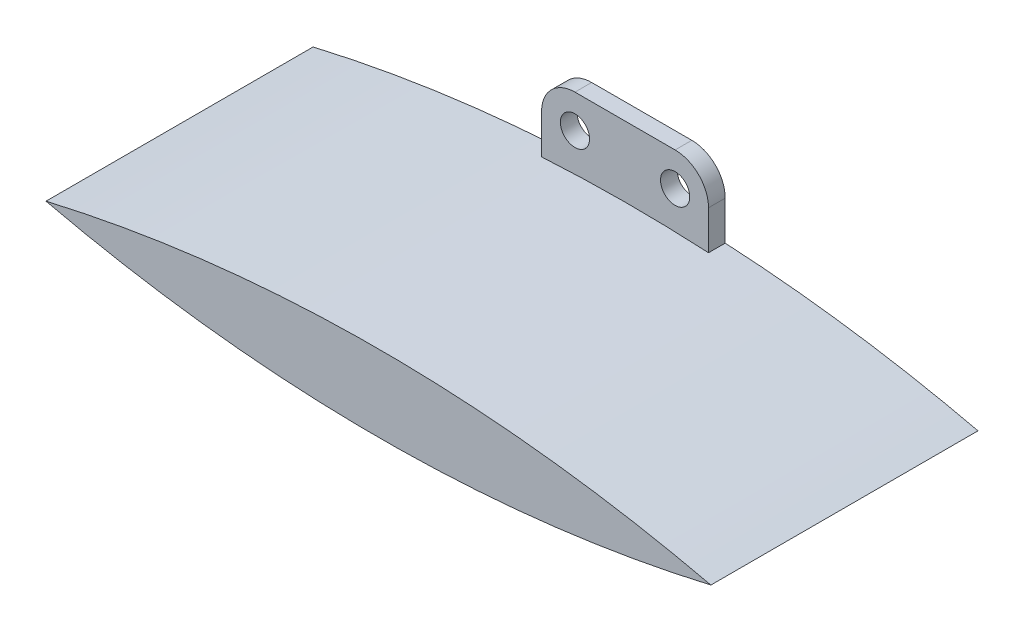
ISO-10303-21;
HEADER;
FILE_DESCRIPTION(('STEP AP214'),'2;1');
FILE_NAME('part.step','',(''),(''),'','','');
FILE_SCHEMA(('AUTOMOTIVE_DESIGN { 1 0 10303 214 1 1 1 1 }'));
ENDSEC;
DATA;
#1=APPLICATION_CONTEXT('core data for automotive mechanical design processes');
#2=APPLICATION_PROTOCOL_DEFINITION('international standard','automotive_design',2000,#1);
#3=PRODUCT_CONTEXT('',#1,'mechanical');
#4=PRODUCT('Part','Part','',(#3));
#5=PRODUCT_RELATED_PRODUCT_CATEGORY('part','',(#4));
#6=PRODUCT_DEFINITION_FORMATION('','',#4);
#7=PRODUCT_DEFINITION_CONTEXT('part definition',#1,'design');
#8=PRODUCT_DEFINITION('design','',#6,#7);
#9=PRODUCT_DEFINITION_SHAPE('','',#8);
#10=(LENGTH_UNIT() NAMED_UNIT(*) SI_UNIT(.MILLI.,.METRE.));
#11=(NAMED_UNIT(*) PLANE_ANGLE_UNIT() SI_UNIT($,.RADIAN.));
#12=(NAMED_UNIT(*) SI_UNIT($,.STERADIAN.) SOLID_ANGLE_UNIT());
#13=UNCERTAINTY_MEASURE_WITH_UNIT(LENGTH_MEASURE(1.E-05),#10,'distance_accuracy_value','');
#14=(GEOMETRIC_REPRESENTATION_CONTEXT(3) GLOBAL_UNCERTAINTY_ASSIGNED_CONTEXT((#13)) GLOBAL_UNIT_ASSIGNED_CONTEXT((#10,
#11,#12)) REPRESENTATION_CONTEXT('',''));
#15=CARTESIAN_POINT('',(0.,0.,0.));
#16=DIRECTION('',(0.,0.,1.));
#17=DIRECTION('',(1.,0.,0.));
#18=AXIS2_PLACEMENT_3D('',#15,#16,#17);
#19=CARTESIAN_POINT('',(-9.2850146485194,-5.0164149337129,2.));
#20=DIRECTION('',(0.,0.,1.));
#21=DIRECTION('',(1.,0.,0.));
#22=AXIS2_PLACEMENT_3D('',#19,#20,#21);
#23=PLANE('',#22);
#24=CARTESIAN_POINT('',(-2.82724176416593,174.391615286075,2.));
#25=DIRECTION('',(0.,0.,1.));
#26=DIRECTION('',(1.,0.,0.));
#27=AXIS2_PLACEMENT_3D('',#24,#25,#26);
#28=CIRCLE('',#27,175.);
#29=CARTESIAN_POINT('',(-13.2850146485194,-0.295633780075577,2.));
#30=VERTEX_POINT('',#29);
#31=CARTESIAN_POINT('',(6.71498535148046,-0.348036486708003,2.));
#32=VERTEX_POINT('',#31);
#33=EDGE_CURVE('E11',#30,#32,#28,.T.);
#34=ORIENTED_EDGE('',*,*,#33,.F.);
#35=DIRECTION('',(0.,-1.,0.));
#36=VECTOR('',#35,1.);
#37=CARTESIAN_POINT('',(-13.2850146485194,-0.295633780075577,2.));
#38=LINE('',#37,#36);
#39=CARTESIAN_POINT('',(-13.2850146485194,-5.0164149337129,2.));
#40=VERTEX_POINT('',#39);
#41=EDGE_CURVE('E54',#30,#40,#38,.T.);
#42=ORIENTED_EDGE('',*,*,#41,.T.);
#43=CARTESIAN_POINT('',(-9.2850146485194,-5.0164149337129,2.));
#44=DIRECTION('',(0.,0.,1.));
#45=DIRECTION('',(1.,0.,0.));
#46=AXIS2_PLACEMENT_3D('',#43,#44,#45);
#47=CIRCLE('',#46,4.);
#48=CARTESIAN_POINT('',(-9.2850146485194,-9.0164149337129,2.));
#49=VERTEX_POINT('',#48);
#50=EDGE_CURVE('E219',#40,#49,#47,.T.);
#51=ORIENTED_EDGE('',*,*,#50,.T.);
#52=DIRECTION('',(1.,0.,0.));
#53=VECTOR('',#52,1.);
#54=CARTESIAN_POINT('',(-9.2850146485194,-9.0164149337129,2.));
#55=LINE('',#54,#53);
#56=CARTESIAN_POINT('',(2.7149853514806,-9.0164149337129,2.));
#57=VERTEX_POINT('',#56);
#58=EDGE_CURVE('E117',#49,#57,#55,.T.);
#59=ORIENTED_EDGE('',*,*,#58,.T.);
#60=CARTESIAN_POINT('',(2.7149853514806,-5.0164149337129,2.));
#61=DIRECTION('',(0.,0.,1.));
#62=DIRECTION('',(1.,0.,0.));
#63=AXIS2_PLACEMENT_3D('',#60,#61,#62);
#64=CIRCLE('',#63,4.);
#65=CARTESIAN_POINT('',(6.7149853514806,-5.0164149337129,2.));
#66=VERTEX_POINT('',#65);
#67=EDGE_CURVE('E250',#57,#66,#64,.T.);
#68=ORIENTED_EDGE('',*,*,#67,.T.);
#69=DIRECTION('',(0.,1.,0.));
#70=VECTOR('',#69,1.);
#71=CARTESIAN_POINT('',(6.7149853514806,-0.348036486708003,2.));
#72=LINE('',#71,#70);
#73=EDGE_CURVE('E191',#66,#32,#72,.T.);
#74=ORIENTED_EDGE('',*,*,#73,.T.);
#75=EDGE_LOOP('',(#34,#42,#51,#59,#68,#74));
#76=FACE_BOUND('',#75,.T.);
#77=CARTESIAN_POINT('',(-9.2850146485194,-5.0164149337129,2.));
#78=DIRECTION('',(0.,0.,1.));
#79=DIRECTION('',(1.,0.,0.));
#80=AXIS2_PLACEMENT_3D('',#77,#78,#79);
#81=CIRCLE('',#80,1.75);
#82=CARTESIAN_POINT('',(-7.5350146485194,-5.0164149337129,2.));
#83=VERTEX_POINT('',#82);
#84=EDGE_CURVE('E257',#83,#83,#81,.T.);
#85=ORIENTED_EDGE('',*,*,#84,.F.);
#86=EDGE_LOOP('',(#85));
#87=FACE_BOUND('',#86,.T.);
#88=CARTESIAN_POINT('',(2.7149853514806,-5.0164149337129,2.));
#89=DIRECTION('',(0.,0.,1.));
#90=DIRECTION('',(1.,0.,0.));
#91=AXIS2_PLACEMENT_3D('',#88,#89,#90);
#92=CIRCLE('',#91,1.75);
#93=CARTESIAN_POINT('',(4.4649853514806,-5.0164149337129,2.));
#94=VERTEX_POINT('',#93);
#95=EDGE_CURVE('E263',#94,#94,#92,.T.);
#96=ORIENTED_EDGE('',*,*,#95,.F.);
#97=EDGE_LOOP('',(#96));
#98=FACE_BOUND('',#97,.T.);
#99=ADVANCED_FACE('F35',(#76,#87,#98),#23,.T.);
#100=CARTESIAN_POINT('',(-2.82724176416593,-166.424445153501,2.));
#101=DIRECTION('',(0.,0.,1.));
#102=DIRECTION('',(1.,0.,0.));
#103=AXIS2_PLACEMENT_3D('',#100,#101,#102);
#104=CIRCLE('',#103,175.);
#105=CARTESIAN_POINT('',(6.7149853514806,8.3152066192822,2.));
#106=VERTEX_POINT('',#105);
#107=CARTESIAN_POINT('',(-13.2850146485194,8.26280391264977,2.));
#108=VERTEX_POINT('',#107);
#109=EDGE_CURVE('E45',#106,#108,#104,.T.);
#110=ORIENTED_EDGE('',*,*,#109,.F.);
#111=DIRECTION('',(0.,1.,0.));
#112=VECTOR('',#111,1.);
#113=CARTESIAN_POINT('',(6.7149853514806,12.9835850662871,2.));
#114=LINE('',#113,#112);
#115=CARTESIAN_POINT('',(6.7149853514806,12.9835850662871,2.));
#116=VERTEX_POINT('',#115);
#117=EDGE_CURVE('E188',#106,#116,#114,.T.);
#118=ORIENTED_EDGE('',*,*,#117,.T.);
#119=CARTESIAN_POINT('',(2.7149853514806,12.9835850662871,2.));
#120=DIRECTION('',(0.,0.,1.));
#121=DIRECTION('',(1.,0.,0.));
#122=AXIS2_PLACEMENT_3D('',#119,#120,#121);
#123=CIRCLE('',#122,4.);
#124=CARTESIAN_POINT('',(2.7149853514806,16.9835850662871,2.));
#125=VERTEX_POINT('',#124);
#126=EDGE_CURVE('E190',#116,#125,#123,.T.);
#127=ORIENTED_EDGE('',*,*,#126,.T.);
#128=DIRECTION('',(-1.,0.,0.));
#129=VECTOR('',#128,1.);
#130=CARTESIAN_POINT('',(-9.2850146485194,16.9835850662871,2.));
#131=LINE('',#130,#129);
#132=CARTESIAN_POINT('',(-9.2850146485194,16.9835850662871,2.));
#133=VERTEX_POINT('',#132);
#134=EDGE_CURVE('E247',#125,#133,#131,.T.);
#135=ORIENTED_EDGE('',*,*,#134,.T.);
#136=CARTESIAN_POINT('',(-9.2850146485194,12.9835850662871,2.));
#137=DIRECTION('',(0.,0.,1.));
#138=DIRECTION('',(1.,0.,0.));
#139=AXIS2_PLACEMENT_3D('',#136,#137,#138);
#140=CIRCLE('',#139,4.);
#141=CARTESIAN_POINT('',(-13.2850146485194,12.9835850662871,2.));
#142=VERTEX_POINT('',#141);
#143=EDGE_CURVE('E152',#133,#142,#140,.T.);
#144=ORIENTED_EDGE('',*,*,#143,.T.);
#145=DIRECTION('',(0.,-1.,0.));
#146=VECTOR('',#145,1.);
#147=CARTESIAN_POINT('',(-13.2850146485194,12.9835850662871,2.));
#148=LINE('',#147,#146);
#149=EDGE_CURVE('E145',#142,#108,#148,.T.);
#150=ORIENTED_EDGE('',*,*,#149,.T.);
#151=EDGE_LOOP('',(#110,#118,#127,#135,#144,#150));
#152=FACE_BOUND('',#151,.T.);
#153=CARTESIAN_POINT('',(-9.2850146485194,12.9835850662871,2.));
#154=DIRECTION('',(0.,0.,1.));
#155=DIRECTION('',(1.,0.,0.));
#156=AXIS2_PLACEMENT_3D('',#153,#154,#155);
#157=CIRCLE('',#156,1.75);
#158=CARTESIAN_POINT('',(-7.5350146485194,12.9835850662871,2.));
#159=VERTEX_POINT('',#158);
#160=EDGE_CURVE('E245',#159,#159,#157,.T.);
#161=ORIENTED_EDGE('',*,*,#160,.F.);
#162=EDGE_LOOP('',(#161));
#163=FACE_BOUND('',#162,.T.);
#164=CARTESIAN_POINT('',(2.7149853514806,12.9835850662871,2.));
#165=DIRECTION('',(0.,0.,1.));
#166=DIRECTION('',(1.,0.,0.));
#167=AXIS2_PLACEMENT_3D('',#164,#165,#166);
#168=CIRCLE('',#167,1.75);
#169=CARTESIAN_POINT('',(4.4649853514806,12.9835850662871,2.));
#170=VERTEX_POINT('',#169);
#171=EDGE_CURVE('E269',#170,#170,#168,.T.);
#172=ORIENTED_EDGE('',*,*,#171,.F.);
#173=EDGE_LOOP('',(#172));
#174=FACE_BOUND('',#173,.T.);
#175=ADVANCED_FACE('F147',(#152,#163,#174),#23,.T.);
#176=CARTESIAN_POINT('',(-9.2850146485194,-5.0164149337129,0.));
#177=DIRECTION('',(0.,0.,1.));
#178=DIRECTION('',(1.,0.,0.));
#179=AXIS2_PLACEMENT_3D('',#176,#177,#178);
#180=PLANE('',#179);
#181=CARTESIAN_POINT('',(2.7149853514806,-5.0164149337129,0.));
#182=DIRECTION('',(0.,0.,1.));
#183=DIRECTION('',(1.,0.,0.));
#184=AXIS2_PLACEMENT_3D('',#181,#182,#183);
#185=CIRCLE('',#184,1.75);
#186=CARTESIAN_POINT('',(4.4649853514806,-5.0164149337129,0.));
#187=VERTEX_POINT('',#186);
#188=EDGE_CURVE('E266',#187,#187,#185,.T.);
#189=ORIENTED_EDGE('',*,*,#188,.T.);
#190=EDGE_LOOP('',(#189));
#191=FACE_BOUND('',#190,.T.);
#192=CARTESIAN_POINT('',(-9.2850146485194,12.9835850662871,0.));
#193=DIRECTION('',(0.,0.,1.));
#194=DIRECTION('',(1.,0.,0.));
#195=AXIS2_PLACEMENT_3D('',#192,#193,#194);
#196=CIRCLE('',#195,1.75);
#197=CARTESIAN_POINT('',(-7.5350146485194,12.9835850662871,0.));
#198=VERTEX_POINT('',#197);
#199=EDGE_CURVE('E254',#198,#198,#196,.T.);
#200=ORIENTED_EDGE('',*,*,#199,.T.);
#201=EDGE_LOOP('',(#200));
#202=FACE_BOUND('',#201,.T.);
#203=CARTESIAN_POINT('',(-9.2850146485194,-5.0164149337129,0.));
#204=DIRECTION('',(0.,0.,1.));
#205=DIRECTION('',(1.,0.,0.));
#206=AXIS2_PLACEMENT_3D('',#203,#204,#205);
#207=CIRCLE('',#206,4.);
#208=CARTESIAN_POINT('',(-13.2850146485194,-5.0164149337129,0.));
#209=VERTEX_POINT('',#208);
#210=CARTESIAN_POINT('',(-9.2850146485194,-9.0164149337129,0.));
#211=VERTEX_POINT('',#210);
#212=EDGE_CURVE('E242',#209,#211,#207,.T.);
#213=ORIENTED_EDGE('',*,*,#212,.F.);
#214=DIRECTION('',(0.,-1.,0.));
#215=VECTOR('',#214,1.);
#216=CARTESIAN_POINT('',(-13.2850146485194,-0.295633780075577,0.));
#217=LINE('',#216,#215);
#218=CARTESIAN_POINT('',(-13.2850146485194,-0.295633780075577,0.));
#219=VERTEX_POINT('',#218);
#220=EDGE_CURVE('E108',#219,#209,#217,.T.);
#221=ORIENTED_EDGE('',*,*,#220,.F.);
#222=CARTESIAN_POINT('',(-2.82724176416593,174.391615286075,0.));
#223=DIRECTION('',(0.,0.,1.));
#224=DIRECTION('',(1.,0.,0.));
#225=AXIS2_PLACEMENT_3D('',#222,#223,#224);
#226=CIRCLE('',#225,175.);
#227=CARTESIAN_POINT('',(-42.6531533872776,3.98358506628713,0.));
#228=VERTEX_POINT('',#227);
#229=EDGE_CURVE('E102',#228,#219,#226,.T.);
#230=ORIENTED_EDGE('',*,*,#229,.F.);
#231=CARTESIAN_POINT('',(-2.82724176416593,-166.424445153501,0.));
#232=DIRECTION('',(0.,0.,1.));
#233=DIRECTION('',(1.,0.,0.));
#234=AXIS2_PLACEMENT_3D('',#231,#232,#233);
#235=CIRCLE('',#234,175.);
#236=CARTESIAN_POINT('',(-13.2850146485194,8.26280391264977,0.));
#237=VERTEX_POINT('',#236);
#238=EDGE_CURVE('E221',#237,#228,#235,.T.);
#239=ORIENTED_EDGE('',*,*,#238,.F.);
#240=DIRECTION('',(0.,-1.,0.));
#241=VECTOR('',#240,1.);
#242=CARTESIAN_POINT('',(-13.2850146485194,12.9835850662871,0.));
#243=LINE('',#242,#241);
#244=CARTESIAN_POINT('',(-13.2850146485194,12.9835850662871,0.));
#245=VERTEX_POINT('',#244);
#246=EDGE_CURVE('E161',#245,#237,#243,.T.);
#247=ORIENTED_EDGE('',*,*,#246,.F.);
#248=CARTESIAN_POINT('',(-9.2850146485194,12.9835850662871,0.));
#249=DIRECTION('',(0.,0.,1.));
#250=DIRECTION('',(1.,0.,0.));
#251=AXIS2_PLACEMENT_3D('',#248,#249,#250);
#252=CIRCLE('',#251,4.);
#253=CARTESIAN_POINT('',(-9.2850146485194,16.9835850662871,0.));
#254=VERTEX_POINT('',#253);
#255=EDGE_CURVE('E224',#254,#245,#252,.T.);
#256=ORIENTED_EDGE('',*,*,#255,.F.);
#257=DIRECTION('',(-1.,0.,0.));
#258=VECTOR('',#257,1.);
#259=CARTESIAN_POINT('',(-9.2850146485194,16.9835850662871,0.));
#260=LINE('',#259,#258);
#261=CARTESIAN_POINT('',(2.7149853514806,16.9835850662871,0.));
#262=VERTEX_POINT('',#261);
#263=EDGE_CURVE('E226',#262,#254,#260,.T.);
#264=ORIENTED_EDGE('',*,*,#263,.F.);
#265=CARTESIAN_POINT('',(2.7149853514806,12.9835850662871,0.));
#266=DIRECTION('',(0.,0.,1.));
#267=DIRECTION('',(1.,0.,0.));
#268=AXIS2_PLACEMENT_3D('',#265,#266,#267);
#269=CIRCLE('',#268,4.);
#270=CARTESIAN_POINT('',(6.7149853514806,12.9835850662871,0.));
#271=VERTEX_POINT('',#270);
#272=EDGE_CURVE('E228',#271,#262,#269,.T.);
#273=ORIENTED_EDGE('',*,*,#272,.F.);
#274=DIRECTION('',(0.,1.,0.));
#275=VECTOR('',#274,1.);
#276=CARTESIAN_POINT('',(6.7149853514806,12.9835850662871,0.));
#277=LINE('',#276,#275);
#278=CARTESIAN_POINT('',(6.7149853514806,8.3152066192822,0.));
#279=VERTEX_POINT('',#278);
#280=EDGE_CURVE('E230',#279,#271,#277,.T.);
#281=ORIENTED_EDGE('',*,*,#280,.F.);
#282=CARTESIAN_POINT('',(-2.82724176416593,-166.424445153501,0.));
#283=DIRECTION('',(0.,0.,1.));
#284=DIRECTION('',(1.,0.,0.));
#285=AXIS2_PLACEMENT_3D('',#282,#283,#284);
#286=CIRCLE('',#285,175.);
#287=CARTESIAN_POINT('',(36.9986698589457,3.98358506628707,0.));
#288=VERTEX_POINT('',#287);
#289=EDGE_CURVE('E232',#288,#279,#286,.T.);
#290=ORIENTED_EDGE('',*,*,#289,.F.);
#291=CARTESIAN_POINT('',(-2.82724176416593,174.391615286075,0.));
#292=DIRECTION('',(0.,0.,1.));
#293=DIRECTION('',(1.,0.,0.));
#294=AXIS2_PLACEMENT_3D('',#291,#292,#293);
#295=CIRCLE('',#294,175.);
#296=CARTESIAN_POINT('',(6.71498535148046,-0.348036486708003,0.));
#297=VERTEX_POINT('',#296);
#298=EDGE_CURVE('E234',#297,#288,#295,.T.);
#299=ORIENTED_EDGE('',*,*,#298,.F.);
#300=DIRECTION('',(0.,1.,0.));
#301=VECTOR('',#300,1.);
#302=CARTESIAN_POINT('',(6.7149853514806,-0.348036486708003,0.));
#303=LINE('',#302,#301);
#304=CARTESIAN_POINT('',(6.7149853514806,-5.0164149337129,0.));
#305=VERTEX_POINT('',#304);
#306=EDGE_CURVE('E236',#305,#297,#303,.T.);
#307=ORIENTED_EDGE('',*,*,#306,.F.);
#308=CARTESIAN_POINT('',(2.7149853514806,-5.0164149337129,0.));
#309=DIRECTION('',(0.,0.,1.));
#310=DIRECTION('',(1.,0.,0.));
#311=AXIS2_PLACEMENT_3D('',#308,#309,#310);
#312=CIRCLE('',#311,4.);
#313=CARTESIAN_POINT('',(2.7149853514806,-9.0164149337129,0.));
#314=VERTEX_POINT('',#313);
#315=EDGE_CURVE('E238',#314,#305,#312,.T.);
#316=ORIENTED_EDGE('',*,*,#315,.F.);
#317=DIRECTION('',(1.,0.,0.));
#318=VECTOR('',#317,1.);
#319=CARTESIAN_POINT('',(-9.2850146485194,-9.0164149337129,0.));
#320=LINE('',#319,#318);
#321=EDGE_CURVE('E240',#211,#314,#320,.T.);
#322=ORIENTED_EDGE('',*,*,#321,.F.);
#323=EDGE_LOOP('',(#213,#221,#230,#239,#247,#256,#264,#273,#281,#290,#299,#307,#316,#322));
#324=FACE_BOUND('',#323,.T.);
#325=CARTESIAN_POINT('',(-9.2850146485194,-5.0164149337129,0.));
#326=DIRECTION('',(0.,0.,1.));
#327=DIRECTION('',(1.,0.,0.));
#328=AXIS2_PLACEMENT_3D('',#325,#326,#327);
#329=CIRCLE('',#328,1.75);
#330=CARTESIAN_POINT('',(-7.5350146485194,-5.0164149337129,0.));
#331=VERTEX_POINT('',#330);
#332=EDGE_CURVE('E260',#331,#331,#329,.T.);
#333=ORIENTED_EDGE('',*,*,#332,.T.);
#334=EDGE_LOOP('',(#333));
#335=FACE_BOUND('',#334,.T.);
#336=CARTESIAN_POINT('',(2.7149853514806,12.9835850662871,0.));
#337=DIRECTION('',(0.,0.,1.));
#338=DIRECTION('',(1.,0.,0.));
#339=AXIS2_PLACEMENT_3D('',#336,#337,#338);
#340=CIRCLE('',#339,1.75);
#341=CARTESIAN_POINT('',(4.4649853514806,12.9835850662871,0.));
#342=VERTEX_POINT('',#341);
#343=EDGE_CURVE('E272',#342,#342,#340,.T.);
#344=ORIENTED_EDGE('',*,*,#343,.T.);
#345=EDGE_LOOP('',(#344));
#346=FACE_BOUND('',#345,.T.);
#347=ADVANCED_FACE('F294',(#191,#202,#324,#335,#346),#180,.F.);
#348=CARTESIAN_POINT('',(-9.2850146485194,-5.0164149337129,2.));
#349=DIRECTION('',(0.,0.,-1.));
#350=DIRECTION('',(-1.,0.,0.));
#351=AXIS2_PLACEMENT_3D('',#348,#349,#350);
#352=CYLINDRICAL_SURFACE('',#351,4.);
#353=ORIENTED_EDGE('',*,*,#212,.T.);
#354=DIRECTION('',(0.,0.,-1.));
#355=VECTOR('',#354,1.);
#356=CARTESIAN_POINT('',(-9.2850146485194,-9.0164149337129,2.));
#357=LINE('',#356,#355);
#358=EDGE_CURVE('E171',#49,#211,#357,.T.);
#359=ORIENTED_EDGE('',*,*,#358,.F.);
#360=ORIENTED_EDGE('',*,*,#50,.F.);
#361=DIRECTION('',(0.,0.,-1.));
#362=VECTOR('',#361,1.);
#363=CARTESIAN_POINT('',(-13.2850146485194,-5.0164149337129,2.));
#364=LINE('',#363,#362);
#365=EDGE_CURVE('E216',#40,#209,#364,.T.);
#366=ORIENTED_EDGE('',*,*,#365,.T.);
#367=EDGE_LOOP('',(#353,#359,#360,#366));
#368=FACE_BOUND('',#367,.T.);
#369=ADVANCED_FACE('F37',(#368),#352,.T.);
#370=CARTESIAN_POINT('',(-9.2850146485194,-9.0164149337129,2.));
#371=DIRECTION('',(0.,1.,0.));
#372=DIRECTION('',(0.,0.,1.));
#373=AXIS2_PLACEMENT_3D('',#370,#371,#372);
#374=PLANE('',#373);
#375=ORIENTED_EDGE('',*,*,#321,.T.);
#376=DIRECTION('',(0.,0.,-1.));
#377=VECTOR('',#376,1.);
#378=CARTESIAN_POINT('',(2.7149853514806,-9.0164149337129,2.));
#379=LINE('',#378,#377);
#380=EDGE_CURVE('E173',#57,#314,#379,.T.);
#381=ORIENTED_EDGE('',*,*,#380,.F.);
#382=ORIENTED_EDGE('',*,*,#58,.F.);
#383=ORIENTED_EDGE('',*,*,#358,.T.);
#384=EDGE_LOOP('',(#375,#381,#382,#383));
#385=FACE_BOUND('',#384,.T.);
#386=ADVANCED_FACE('F490',(#385),#374,.F.);
#387=CARTESIAN_POINT('',(2.7149853514806,-5.0164149337129,2.));
#388=DIRECTION('',(0.,0.,-1.));
#389=DIRECTION('',(-1.,0.,0.));
#390=AXIS2_PLACEMENT_3D('',#387,#388,#389);
#391=CYLINDRICAL_SURFACE('',#390,4.);
#392=ORIENTED_EDGE('',*,*,#315,.T.);
#393=DIRECTION('',(0.,0.,-1.));
#394=VECTOR('',#393,1.);
#395=CARTESIAN_POINT('',(6.7149853514806,-5.0164149337129,2.));
#396=LINE('',#395,#394);
#397=EDGE_CURVE('E199',#66,#305,#396,.T.);
#398=ORIENTED_EDGE('',*,*,#397,.F.);
#399=ORIENTED_EDGE('',*,*,#67,.F.);
#400=ORIENTED_EDGE('',*,*,#380,.T.);
#401=EDGE_LOOP('',(#392,#398,#399,#400));
#402=FACE_BOUND('',#401,.T.);
#403=ADVANCED_FACE('F453',(#402),#391,.T.);
#404=CARTESIAN_POINT('',(6.7149853514806,-0.348036486708003,2.));
#405=DIRECTION('',(-1.,0.,0.));
#406=DIRECTION('',(0.,-1.,0.));
#407=AXIS2_PLACEMENT_3D('',#404,#405,#406);
#408=PLANE('',#407);
#409=ORIENTED_EDGE('',*,*,#306,.T.);
#410=DIRECTION('',(0.,0.,-1.));
#411=VECTOR('',#410,1.);
#412=CARTESIAN_POINT('',(6.71498535148046,-0.348036486708003,2.));
#413=LINE('',#412,#411);
#414=EDGE_CURVE('E202',#32,#297,#413,.T.);
#415=ORIENTED_EDGE('',*,*,#414,.F.);
#416=ORIENTED_EDGE('',*,*,#73,.F.);
#417=ORIENTED_EDGE('',*,*,#397,.T.);
#418=EDGE_LOOP('',(#409,#415,#416,#417));
#419=FACE_BOUND('',#418,.T.);
#420=ADVANCED_FACE('F448',(#419),#408,.F.);
#421=CARTESIAN_POINT('',(6.7149853514806,12.9835850662871,2.));
#422=DIRECTION('',(-1.,0.,0.));
#423=DIRECTION('',(0.,0.,1.));
#424=AXIS2_PLACEMENT_3D('',#421,#422,#423);
#425=PLANE('',#424);
#426=ORIENTED_EDGE('',*,*,#280,.T.);
#427=DIRECTION('',(0.,0.,-1.));
#428=VECTOR('',#427,1.);
#429=CARTESIAN_POINT('',(6.7149853514806,12.9835850662871,2.));
#430=LINE('',#429,#428);
#431=EDGE_CURVE('E185',#116,#271,#430,.T.);
#432=ORIENTED_EDGE('',*,*,#431,.F.);
#433=ORIENTED_EDGE('',*,*,#117,.F.);
#434=DIRECTION('',(0.,0.,-1.));
#435=VECTOR('',#434,1.);
#436=CARTESIAN_POINT('',(6.7149853514806,8.3152066192822,2.));
#437=LINE('',#436,#435);
#438=EDGE_CURVE('E169',#106,#279,#437,.T.);
#439=ORIENTED_EDGE('',*,*,#438,.T.);
#440=EDGE_LOOP('',(#426,#432,#433,#439));
#441=FACE_BOUND('',#440,.T.);
#442=ADVANCED_FACE('F319',(#441),#425,.F.);
#443=CARTESIAN_POINT('',(2.7149853514806,12.9835850662871,2.));
#444=DIRECTION('',(0.,0.,-1.));
#445=DIRECTION('',(-1.,0.,0.));
#446=AXIS2_PLACEMENT_3D('',#443,#444,#445);
#447=CYLINDRICAL_SURFACE('',#446,4.);
#448=ORIENTED_EDGE('',*,*,#272,.T.);
#449=DIRECTION('',(0.,0.,-1.));
#450=VECTOR('',#449,1.);
#451=CARTESIAN_POINT('',(2.7149853514806,16.9835850662871,2.));
#452=LINE('',#451,#450);
#453=EDGE_CURVE('E207',#125,#262,#452,.T.);
#454=ORIENTED_EDGE('',*,*,#453,.F.);
#455=ORIENTED_EDGE('',*,*,#126,.F.);
#456=ORIENTED_EDGE('',*,*,#431,.T.);
#457=EDGE_LOOP('',(#448,#454,#455,#456));
#458=FACE_BOUND('',#457,.T.);
#459=ADVANCED_FACE('F326',(#458),#447,.T.);
#460=CARTESIAN_POINT('',(-9.2850146485194,16.9835850662871,2.));
#461=DIRECTION('',(0.,-1.,0.));
#462=DIRECTION('',(0.,0.,-1.));
#463=AXIS2_PLACEMENT_3D('',#460,#461,#462);
#464=PLANE('',#463);
#465=ORIENTED_EDGE('',*,*,#263,.T.);
#466=DIRECTION('',(0.,0.,-1.));
#467=VECTOR('',#466,1.);
#468=CARTESIAN_POINT('',(-9.2850146485194,16.9835850662871,2.));
#469=LINE('',#468,#467);
#470=EDGE_CURVE('E210',#133,#254,#469,.T.);
#471=ORIENTED_EDGE('',*,*,#470,.F.);
#472=ORIENTED_EDGE('',*,*,#134,.F.);
#473=ORIENTED_EDGE('',*,*,#453,.T.);
#474=EDGE_LOOP('',(#465,#471,#472,#473));
#475=FACE_BOUND('',#474,.T.);
#476=ADVANCED_FACE('F329',(#475),#464,.F.);
#477=CARTESIAN_POINT('',(-9.2850146485194,12.9835850662871,2.));
#478=DIRECTION('',(0.,0.,-1.));
#479=DIRECTION('',(-1.,0.,0.));
#480=AXIS2_PLACEMENT_3D('',#477,#478,#479);
#481=CYLINDRICAL_SURFACE('',#480,4.);
#482=ORIENTED_EDGE('',*,*,#255,.T.);
#483=DIRECTION('',(0.,0.,-1.));
#484=VECTOR('',#483,1.);
#485=CARTESIAN_POINT('',(-13.2850146485194,12.9835850662871,2.));
#486=LINE('',#485,#484);
#487=EDGE_CURVE('E164',#142,#245,#486,.T.);
#488=ORIENTED_EDGE('',*,*,#487,.F.);
#489=ORIENTED_EDGE('',*,*,#143,.F.);
#490=ORIENTED_EDGE('',*,*,#470,.T.);
#491=EDGE_LOOP('',(#482,#488,#489,#490));
#492=FACE_BOUND('',#491,.T.);
#493=ADVANCED_FACE('F331',(#492),#481,.T.);
#494=CARTESIAN_POINT('',(-13.2850146485194,12.9835850662871,2.));
#495=DIRECTION('',(1.,0.,0.));
#496=DIRECTION('',(0.,0.,-1.));
#497=AXIS2_PLACEMENT_3D('',#494,#495,#496);
#498=PLANE('',#497);
#499=ORIENTED_EDGE('',*,*,#246,.T.);
#500=DIRECTION('',(0.,0.,-1.));
#501=VECTOR('',#500,1.);
#502=CARTESIAN_POINT('',(-13.2850146485194,8.26280391264977,2.));
#503=LINE('',#502,#501);
#504=EDGE_CURVE('E158',#108,#237,#503,.T.);
#505=ORIENTED_EDGE('',*,*,#504,.F.);
#506=ORIENTED_EDGE('',*,*,#149,.F.);
#507=ORIENTED_EDGE('',*,*,#487,.T.);
#508=EDGE_LOOP('',(#499,#505,#506,#507));
#509=FACE_BOUND('',#508,.T.);
#510=ADVANCED_FACE('F159',(#509),#498,.F.);
#511=CARTESIAN_POINT('',(-2.82724176416593,-166.424445153501,2.));
#512=DIRECTION('',(0.,0.,-1.));
#513=DIRECTION('',(-1.,0.,0.));
#514=AXIS2_PLACEMENT_3D('',#511,#512,#513);
#515=CYLINDRICAL_SURFACE('',#514,175.);
#516=ORIENTED_EDGE('',*,*,#238,.T.);
#517=DIRECTION('',(0.,0.,-1.));
#518=VECTOR('',#517,1.);
#519=CARTESIAN_POINT('',(-42.6531533872776,3.98358506628713,2.));
#520=LINE('',#519,#518);
#521=CARTESIAN_POINT('',(-42.6531533872776,3.98358506628707,32.));
#522=VERTEX_POINT('',#521);
#523=EDGE_CURVE('E165',#522,#228,#520,.T.);
#524=ORIENTED_EDGE('',*,*,#523,.F.);
#525=CARTESIAN_POINT('',(-2.82724176416593,-166.424445153501,32.));
#526=DIRECTION('',(0.,0.,1.));
#527=DIRECTION('',(1.,0.,0.));
#528=AXIS2_PLACEMENT_3D('',#525,#526,#527);
#529=CIRCLE('',#528,175.);
#530=CARTESIAN_POINT('',(36.9986698589457,3.98358506628707,32.));
#531=VERTEX_POINT('',#530);
#532=EDGE_CURVE('E275',#531,#522,#529,.T.);
#533=ORIENTED_EDGE('',*,*,#532,.F.);
#534=DIRECTION('',(0.,0.,-1.));
#535=VECTOR('',#534,1.);
#536=CARTESIAN_POINT('',(36.9986698589457,3.98358506628707,2.));
#537=LINE('',#536,#535);
#538=EDGE_CURVE('E184',#531,#288,#537,.T.);
#539=ORIENTED_EDGE('',*,*,#538,.T.);
#540=ORIENTED_EDGE('',*,*,#289,.T.);
#541=ORIENTED_EDGE('',*,*,#438,.F.);
#542=ORIENTED_EDGE('',*,*,#109,.T.);
#543=ORIENTED_EDGE('',*,*,#504,.T.);
#544=EDGE_LOOP('',(#516,#524,#533,#539,#540,#541,#542,#543));
#545=FACE_BOUND('',#544,.T.);
#546=ADVANCED_FACE('F167',(#545),#515,.T.);
#547=CARTESIAN_POINT('',(-2.82724176416593,174.391615286075,2.));
#548=DIRECTION('',(0.,0.,-1.));
#549=DIRECTION('',(-1.,0.,0.));
#550=AXIS2_PLACEMENT_3D('',#547,#548,#549);
#551=CYLINDRICAL_SURFACE('',#550,175.);
#552=ORIENTED_EDGE('',*,*,#229,.T.);
#553=DIRECTION('',(0.,0.,-1.));
#554=VECTOR('',#553,1.);
#555=CARTESIAN_POINT('',(-13.2850146485194,-0.295633780075577,2.));
#556=LINE('',#555,#554);
#557=EDGE_CURVE('E215',#30,#219,#556,.T.);
#558=ORIENTED_EDGE('',*,*,#557,.F.);
#559=ORIENTED_EDGE('',*,*,#33,.T.);
#560=ORIENTED_EDGE('',*,*,#414,.T.);
#561=ORIENTED_EDGE('',*,*,#298,.T.);
#562=ORIENTED_EDGE('',*,*,#538,.F.);
#563=CARTESIAN_POINT('',(-2.82724176416593,174.391615286075,32.));
#564=DIRECTION('',(0.,0.,1.));
#565=DIRECTION('',(1.,0.,0.));
#566=AXIS2_PLACEMENT_3D('',#563,#564,#565);
#567=CIRCLE('',#566,175.);
#568=EDGE_CURVE('E281',#522,#531,#567,.T.);
#569=ORIENTED_EDGE('',*,*,#568,.F.);
#570=ORIENTED_EDGE('',*,*,#523,.T.);
#571=EDGE_LOOP('',(#552,#558,#559,#560,#561,#562,#569,#570));
#572=FACE_BOUND('',#571,.T.);
#573=ADVANCED_FACE('F290',(#572),#551,.T.);
#574=CARTESIAN_POINT('',(-13.2850146485194,-0.295633780075577,2.));
#575=DIRECTION('',(1.,0.,0.));
#576=DIRECTION('',(0.,0.,-1.));
#577=AXIS2_PLACEMENT_3D('',#574,#575,#576);
#578=PLANE('',#577);
#579=ORIENTED_EDGE('',*,*,#220,.T.);
#580=ORIENTED_EDGE('',*,*,#365,.F.);
#581=ORIENTED_EDGE('',*,*,#41,.F.);
#582=ORIENTED_EDGE('',*,*,#557,.T.);
#583=EDGE_LOOP('',(#579,#580,#581,#582));
#584=FACE_BOUND('',#583,.T.);
#585=ADVANCED_FACE('F301',(#584),#578,.F.);
#586=CARTESIAN_POINT('',(-9.2850146485194,12.9835850662871,2.));
#587=DIRECTION('',(0.,0.,-1.));
#588=DIRECTION('',(-1.,0.,0.));
#589=AXIS2_PLACEMENT_3D('',#586,#587,#588);
#590=CYLINDRICAL_SURFACE('',#589,1.75);
#591=ORIENTED_EDGE('',*,*,#160,.T.);
#592=EDGE_LOOP('',(#591));
#593=FACE_BOUND('',#592,.T.);
#594=ORIENTED_EDGE('',*,*,#199,.F.);
#595=EDGE_LOOP('',(#594));
#596=FACE_BOUND('',#595,.T.);
#597=ADVANCED_FACE('F348',(#593,#596),#590,.F.);
#598=CARTESIAN_POINT('',(-9.2850146485194,-5.0164149337129,2.));
#599=DIRECTION('',(0.,0.,-1.));
#600=DIRECTION('',(-1.,0.,0.));
#601=AXIS2_PLACEMENT_3D('',#598,#599,#600);
#602=CYLINDRICAL_SURFACE('',#601,1.75);
#603=ORIENTED_EDGE('',*,*,#84,.T.);
#604=EDGE_LOOP('',(#603));
#605=FACE_BOUND('',#604,.T.);
#606=ORIENTED_EDGE('',*,*,#332,.F.);
#607=EDGE_LOOP('',(#606));
#608=FACE_BOUND('',#607,.T.);
#609=ADVANCED_FACE('F377',(#605,#608),#602,.F.);
#610=CARTESIAN_POINT('',(2.7149853514806,-5.0164149337129,2.));
#611=DIRECTION('',(0.,0.,-1.));
#612=DIRECTION('',(-1.,0.,0.));
#613=AXIS2_PLACEMENT_3D('',#610,#611,#612);
#614=CYLINDRICAL_SURFACE('',#613,1.75);
#615=ORIENTED_EDGE('',*,*,#95,.T.);
#616=EDGE_LOOP('',(#615));
#617=FACE_BOUND('',#616,.T.);
#618=ORIENTED_EDGE('',*,*,#188,.F.);
#619=EDGE_LOOP('',(#618));
#620=FACE_BOUND('',#619,.T.);
#621=ADVANCED_FACE('F384',(#617,#620),#614,.F.);
#622=CARTESIAN_POINT('',(2.7149853514806,12.9835850662871,2.));
#623=DIRECTION('',(0.,0.,-1.));
#624=DIRECTION('',(-1.,0.,0.));
#625=AXIS2_PLACEMENT_3D('',#622,#623,#624);
#626=CYLINDRICAL_SURFACE('',#625,1.75);
#627=ORIENTED_EDGE('',*,*,#171,.T.);
#628=EDGE_LOOP('',(#627));
#629=FACE_BOUND('',#628,.T.);
#630=ORIENTED_EDGE('',*,*,#343,.F.);
#631=EDGE_LOOP('',(#630));
#632=FACE_BOUND('',#631,.T.);
#633=ADVANCED_FACE('F391',(#629,#632),#626,.F.);
#634=CARTESIAN_POINT('',(-2.82724176416593,3.9835850662871,32.));
#635=DIRECTION('',(0.,0.,1.));
#636=DIRECTION('',(1.,0.,0.));
#637=AXIS2_PLACEMENT_3D('',#634,#635,#636);
#638=PLANE('',#637);
#639=ORIENTED_EDGE('',*,*,#568,.T.);
#640=ORIENTED_EDGE('',*,*,#532,.T.);
#641=EDGE_LOOP('',(#639,#640));
#642=FACE_BOUND('',#641,.T.);
#643=ADVANCED_FACE('F287',(#642),#638,.T.);
#644=CLOSED_SHELL('',(#99,#175,#347,#369,#386,#403,#420,#442,#459,#476,#493,#510,#546,#573,#585,
#597,#609,#621,#633,#643));
#645=MANIFOLD_SOLID_BREP('B2',#644);
#646=ADVANCED_BREP_SHAPE_REPRESENTATION('',(#18,#645),#14);
#647=SHAPE_DEFINITION_REPRESENTATION(#9,#646);
ENDSEC;
END-ISO-10303-21;
